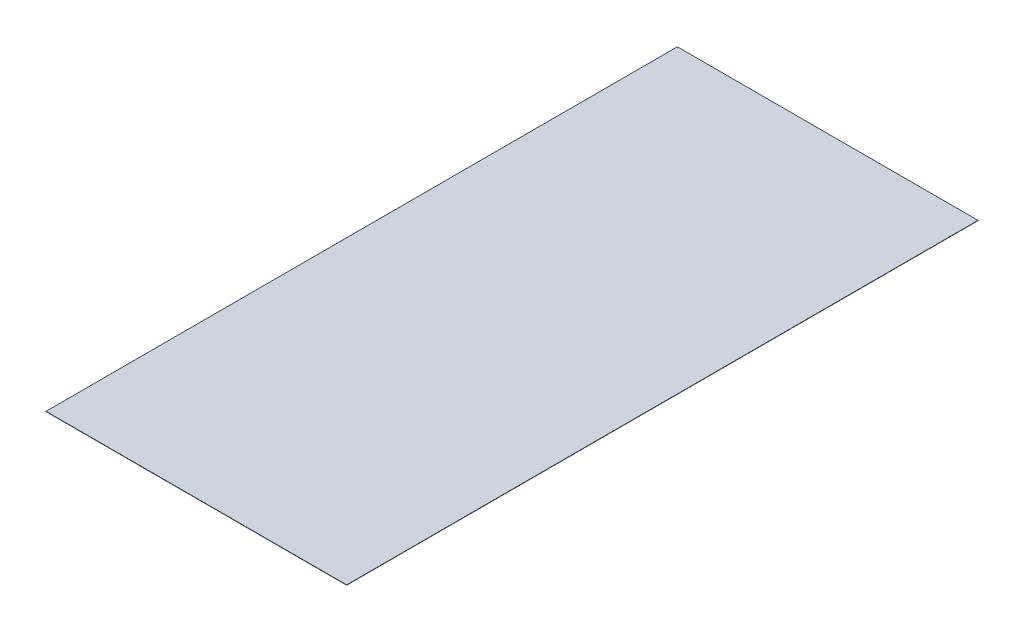
ISO-10303-21;
HEADER;
FILE_DESCRIPTION(('STEP AP214'),'2;1');
FILE_NAME('part.step','',(''),(''),'','','');
FILE_SCHEMA(('AUTOMOTIVE_DESIGN { 1 0 10303 214 1 1 1 1 }'));
ENDSEC;
DATA;
#1=APPLICATION_CONTEXT('core data for automotive mechanical design processes');
#2=APPLICATION_PROTOCOL_DEFINITION('international standard','automotive_design',2000,#1);
#3=PRODUCT_CONTEXT('',#1,'mechanical');
#4=PRODUCT('Part','Part','',(#3));
#5=PRODUCT_RELATED_PRODUCT_CATEGORY('part','',(#4));
#6=PRODUCT_DEFINITION_FORMATION('','',#4);
#7=PRODUCT_DEFINITION_CONTEXT('part definition',#1,'design');
#8=PRODUCT_DEFINITION('design','',#6,#7);
#9=PRODUCT_DEFINITION_SHAPE('','',#8);
#10=(LENGTH_UNIT() NAMED_UNIT(*) SI_UNIT(.MILLI.,.METRE.));
#11=(NAMED_UNIT(*) PLANE_ANGLE_UNIT() SI_UNIT($,.RADIAN.));
#12=(NAMED_UNIT(*) SI_UNIT($,.STERADIAN.) SOLID_ANGLE_UNIT());
#13=UNCERTAINTY_MEASURE_WITH_UNIT(LENGTH_MEASURE(1.E-05),#10,'distance_accuracy_value','');
#14=(GEOMETRIC_REPRESENTATION_CONTEXT(3) GLOBAL_UNCERTAINTY_ASSIGNED_CONTEXT((#13)) GLOBAL_UNIT_ASSIGNED_CONTEXT((#10,
#11,#12)) REPRESENTATION_CONTEXT('',''));
#15=CARTESIAN_POINT('',(0.,0.,0.));
#16=DIRECTION('',(0.,0.,1.));
#17=DIRECTION('',(1.,0.,0.));
#18=AXIS2_PLACEMENT_3D('',#15,#16,#17);
#19=CARTESIAN_POINT('',(-500.,1.,-1050.));
#20=DIRECTION('',(1.,0.,0.));
#21=DIRECTION('',(0.,0.,-1.));
#22=AXIS2_PLACEMENT_3D('',#19,#20,#21);
#23=PLANE('',#22);
#24=DIRECTION('',(0.,0.,1.));
#25=VECTOR('',#24,1.);
#26=CARTESIAN_POINT('',(-500.,0.,-1050.));
#27=LINE('',#26,#25);
#28=CARTESIAN_POINT('',(-500.,0.,-1050.));
#29=VERTEX_POINT('',#28);
#30=CARTESIAN_POINT('',(-500.,0.,1050.));
#31=VERTEX_POINT('',#30);
#32=EDGE_CURVE('E113',#29,#31,#27,.T.);
#33=ORIENTED_EDGE('',*,*,#32,.T.);
#34=DIRECTION('',(0.,-1.,0.));
#35=VECTOR('',#34,1.);
#36=CARTESIAN_POINT('',(-500.,1.,1050.));
#37=LINE('',#36,#35);
#38=CARTESIAN_POINT('',(-500.,1.,1050.));
#39=VERTEX_POINT('',#38);
#40=EDGE_CURVE('E11',#39,#31,#37,.T.);
#41=ORIENTED_EDGE('',*,*,#40,.F.);
#42=DIRECTION('',(0.,0.,1.));
#43=VECTOR('',#42,1.);
#44=CARTESIAN_POINT('',(-500.,1.,-1050.));
#45=LINE('',#44,#43);
#46=CARTESIAN_POINT('',(-500.,1.,-1050.));
#47=VERTEX_POINT('',#46);
#48=EDGE_CURVE('E97',#47,#39,#45,.T.);
#49=ORIENTED_EDGE('',*,*,#48,.F.);
#50=DIRECTION('',(0.,-1.,0.));
#51=VECTOR('',#50,1.);
#52=CARTESIAN_POINT('',(-500.,1.,-1050.));
#53=LINE('',#52,#51);
#54=EDGE_CURVE('E109',#47,#29,#53,.T.);
#55=ORIENTED_EDGE('',*,*,#54,.T.);
#56=EDGE_LOOP('',(#33,#41,#49,#55));
#57=FACE_BOUND('',#56,.T.);
#58=ADVANCED_FACE('F45',(#57),#23,.F.);
#59=CARTESIAN_POINT('',(500.,1.,1050.));
#60=DIRECTION('',(0.,0.,-1.));
#61=DIRECTION('',(-1.,0.,0.));
#62=AXIS2_PLACEMENT_3D('',#59,#60,#61);
#63=PLANE('',#62);
#64=DIRECTION('',(1.,0.,0.));
#65=VECTOR('',#64,1.);
#66=CARTESIAN_POINT('',(500.,0.,1050.));
#67=LINE('',#66,#65);
#68=CARTESIAN_POINT('',(500.,0.,1050.));
#69=VERTEX_POINT('',#68);
#70=EDGE_CURVE('E102',#31,#69,#67,.T.);
#71=ORIENTED_EDGE('',*,*,#70,.T.);
#72=DIRECTION('',(0.,-1.,0.));
#73=VECTOR('',#72,1.);
#74=CARTESIAN_POINT('',(500.,1.,1050.));
#75=LINE('',#74,#73);
#76=CARTESIAN_POINT('',(500.,1.,1050.));
#77=VERTEX_POINT('',#76);
#78=EDGE_CURVE('E54',#77,#69,#75,.T.);
#79=ORIENTED_EDGE('',*,*,#78,.F.);
#80=DIRECTION('',(1.,0.,0.));
#81=VECTOR('',#80,1.);
#82=CARTESIAN_POINT('',(500.,1.,1050.));
#83=LINE('',#82,#81);
#84=EDGE_CURVE('E92',#39,#77,#83,.T.);
#85=ORIENTED_EDGE('',*,*,#84,.F.);
#86=ORIENTED_EDGE('',*,*,#40,.T.);
#87=EDGE_LOOP('',(#71,#79,#85,#86));
#88=FACE_BOUND('',#87,.T.);
#89=ADVANCED_FACE('F101',(#88),#63,.F.);
#90=CARTESIAN_POINT('',(500.,1.,-1050.));
#91=DIRECTION('',(-1.,0.,0.));
#92=DIRECTION('',(0.,0.,1.));
#93=AXIS2_PLACEMENT_3D('',#90,#91,#92);
#94=PLANE('',#93);
#95=DIRECTION('',(0.,0.,-1.));
#96=VECTOR('',#95,1.);
#97=CARTESIAN_POINT('',(500.,0.,-1050.));
#98=LINE('',#97,#96);
#99=CARTESIAN_POINT('',(500.,0.,-1050.));
#100=VERTEX_POINT('',#99);
#101=EDGE_CURVE('E79',#69,#100,#98,.T.);
#102=ORIENTED_EDGE('',*,*,#101,.T.);
#103=DIRECTION('',(0.,-1.,0.));
#104=VECTOR('',#103,1.);
#105=CARTESIAN_POINT('',(500.,1.,-1050.));
#106=LINE('',#105,#104);
#107=CARTESIAN_POINT('',(500.,1.,-1050.));
#108=VERTEX_POINT('',#107);
#109=EDGE_CURVE('E104',#108,#100,#106,.T.);
#110=ORIENTED_EDGE('',*,*,#109,.F.);
#111=DIRECTION('',(0.,0.,-1.));
#112=VECTOR('',#111,1.);
#113=CARTESIAN_POINT('',(500.,1.,-1050.));
#114=LINE('',#113,#112);
#115=EDGE_CURVE('E95',#77,#108,#114,.T.);
#116=ORIENTED_EDGE('',*,*,#115,.F.);
#117=ORIENTED_EDGE('',*,*,#78,.T.);
#118=EDGE_LOOP('',(#102,#110,#116,#117));
#119=FACE_BOUND('',#118,.T.);
#120=ADVANCED_FACE('F105',(#119),#94,.F.);
#121=CARTESIAN_POINT('',(500.,1.,-1050.));
#122=DIRECTION('',(0.,0.,1.));
#123=DIRECTION('',(1.,0.,0.));
#124=AXIS2_PLACEMENT_3D('',#121,#122,#123);
#125=PLANE('',#124);
#126=DIRECTION('',(-1.,0.,0.));
#127=VECTOR('',#126,1.);
#128=CARTESIAN_POINT('',(500.,0.,-1050.));
#129=LINE('',#128,#127);
#130=EDGE_CURVE('E85',#100,#29,#129,.T.);
#131=ORIENTED_EDGE('',*,*,#130,.T.);
#132=ORIENTED_EDGE('',*,*,#54,.F.);
#133=DIRECTION('',(-1.,0.,0.));
#134=VECTOR('',#133,1.);
#135=CARTESIAN_POINT('',(500.,1.,-1050.));
#136=LINE('',#135,#134);
#137=EDGE_CURVE('E62',#108,#47,#136,.T.);
#138=ORIENTED_EDGE('',*,*,#137,.F.);
#139=ORIENTED_EDGE('',*,*,#109,.T.);
#140=EDGE_LOOP('',(#131,#132,#138,#139));
#141=FACE_BOUND('',#140,.T.);
#142=ADVANCED_FACE('F126',(#141),#125,.F.);
#143=CARTESIAN_POINT('',(0.,1.,0.));
#144=DIRECTION('',(0.,-1.,0.));
#145=DIRECTION('',(0.,0.,-1.));
#146=AXIS2_PLACEMENT_3D('',#143,#144,#145);
#147=PLANE('',#146);
#148=ORIENTED_EDGE('',*,*,#48,.T.);
#149=ORIENTED_EDGE('',*,*,#84,.T.);
#150=ORIENTED_EDGE('',*,*,#115,.T.);
#151=ORIENTED_EDGE('',*,*,#137,.T.);
#152=EDGE_LOOP('',(#148,#149,#150,#151));
#153=FACE_BOUND('',#152,.T.);
#154=ADVANCED_FACE('F93',(#153),#147,.F.);
#155=CARTESIAN_POINT('',(0.,0.,0.));
#156=DIRECTION('',(0.,-1.,0.));
#157=DIRECTION('',(0.,0.,-1.));
#158=AXIS2_PLACEMENT_3D('',#155,#156,#157);
#159=PLANE('',#158);
#160=ORIENTED_EDGE('',*,*,#32,.F.);
#161=ORIENTED_EDGE('',*,*,#130,.F.);
#162=ORIENTED_EDGE('',*,*,#101,.F.);
#163=ORIENTED_EDGE('',*,*,#70,.F.);
#164=EDGE_LOOP('',(#160,#161,#162,#163));
#165=FACE_BOUND('',#164,.T.);
#166=ADVANCED_FACE('F129',(#165),#159,.T.);
#167=CLOSED_SHELL('',(#58,#89,#120,#142,#154,#166));
#168=MANIFOLD_SOLID_BREP('B2',#167);
#169=ADVANCED_BREP_SHAPE_REPRESENTATION('',(#18,#168),#14);
#170=SHAPE_DEFINITION_REPRESENTATION(#9,#169);
ENDSEC;
END-ISO-10303-21;
